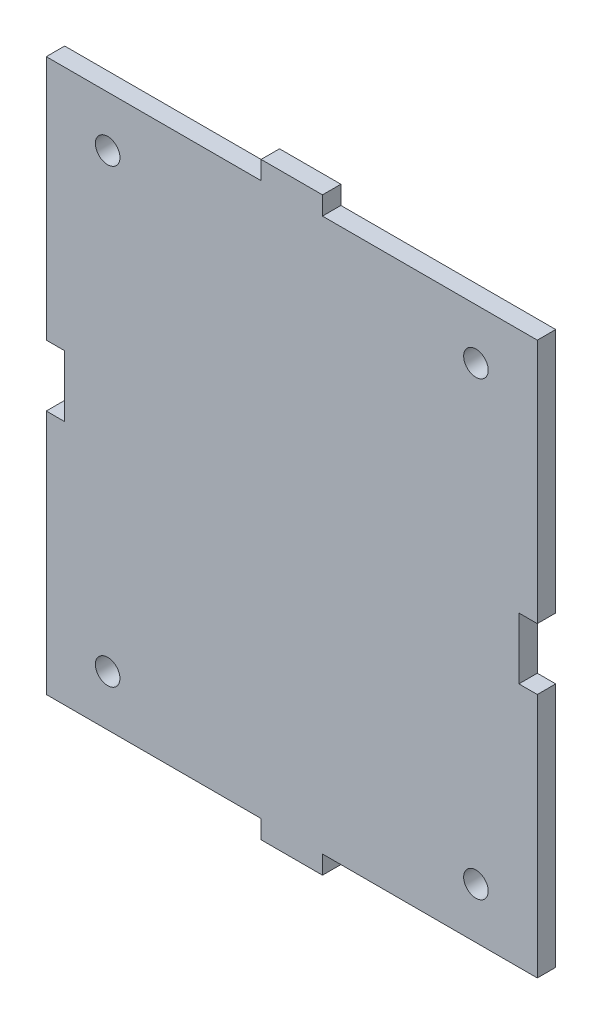
ISO-10303-21;
HEADER;
FILE_DESCRIPTION(('STEP AP214'),'2;1');
FILE_NAME('part.step','',(''),(''),'','','');
FILE_SCHEMA(('AUTOMOTIVE_DESIGN { 1 0 10303 214 1 1 1 1 }'));
ENDSEC;
DATA;
#1=APPLICATION_CONTEXT('core data for automotive mechanical design processes');
#2=APPLICATION_PROTOCOL_DEFINITION('international standard','automotive_design',2000,#1);
#3=PRODUCT_CONTEXT('',#1,'mechanical');
#4=PRODUCT('Part','Part','',(#3));
#5=PRODUCT_RELATED_PRODUCT_CATEGORY('part','',(#4));
#6=PRODUCT_DEFINITION_FORMATION('','',#4);
#7=PRODUCT_DEFINITION_CONTEXT('part definition',#1,'design');
#8=PRODUCT_DEFINITION('design','',#6,#7);
#9=PRODUCT_DEFINITION_SHAPE('','',#8);
#10=(LENGTH_UNIT() NAMED_UNIT(*) SI_UNIT(.MILLI.,.METRE.));
#11=(NAMED_UNIT(*) PLANE_ANGLE_UNIT() SI_UNIT($,.RADIAN.));
#12=(NAMED_UNIT(*) SI_UNIT($,.STERADIAN.) SOLID_ANGLE_UNIT());
#13=UNCERTAINTY_MEASURE_WITH_UNIT(LENGTH_MEASURE(1.E-05),#10,'distance_accuracy_value','');
#14=(GEOMETRIC_REPRESENTATION_CONTEXT(3) GLOBAL_UNCERTAINTY_ASSIGNED_CONTEXT((#13)) GLOBAL_UNIT_ASSIGNED_CONTEXT((#10,
#11,#12)) REPRESENTATION_CONTEXT('',''));
#15=CARTESIAN_POINT('',(0.,0.,0.));
#16=DIRECTION('',(0.,0.,1.));
#17=DIRECTION('',(1.,0.,0.));
#18=AXIS2_PLACEMENT_3D('',#15,#16,#17);
#19=CARTESIAN_POINT('',(0.,0.,3.));
#20=DIRECTION('',(0.,0.,-1.));
#21=DIRECTION('',(-1.,0.,0.));
#22=AXIS2_PLACEMENT_3D('',#19,#20,#21);
#23=PLANE('',#22);
#24=DIRECTION('',(-1.,0.,0.));
#25=VECTOR('',#24,1.);
#26=CARTESIAN_POINT('',(-40.,8.24999999999999,3.));
#27=LINE('',#26,#25);
#28=CARTESIAN_POINT('',(-5.,8.24999999999999,3.));
#29=VERTEX_POINT('',#28);
#30=CARTESIAN_POINT('',(-40.,8.24999999999999,3.));
#31=VERTEX_POINT('',#30);
#32=EDGE_CURVE('E245',#29,#31,#27,.T.);
#33=ORIENTED_EDGE('',*,*,#32,.T.);
#34=DIRECTION('',(0.,-1.,0.));
#35=VECTOR('',#34,1.);
#36=CARTESIAN_POINT('',(-40.,-31.75,3.));
#37=LINE('',#36,#35);
#38=CARTESIAN_POINT('',(-40.,-31.75,3.));
#39=VERTEX_POINT('',#38);
#40=EDGE_CURVE('E133',#31,#39,#37,.T.);
#41=ORIENTED_EDGE('',*,*,#40,.T.);
#42=DIRECTION('',(1.,0.,0.));
#43=VECTOR('',#42,1.);
#44=CARTESIAN_POINT('',(-37.,-31.75,3.));
#45=LINE('',#44,#43);
#46=CARTESIAN_POINT('',(-37.,-31.75,3.));
#47=VERTEX_POINT('',#46);
#48=EDGE_CURVE('E296',#39,#47,#45,.T.);
#49=ORIENTED_EDGE('',*,*,#48,.T.);
#50=DIRECTION('',(0.,-1.,0.));
#51=VECTOR('',#50,1.);
#52=CARTESIAN_POINT('',(-37.,-41.75,3.));
#53=LINE('',#52,#51);
#54=CARTESIAN_POINT('',(-37.,-41.75,3.));
#55=VERTEX_POINT('',#54);
#56=EDGE_CURVE('E315',#47,#55,#53,.T.);
#57=ORIENTED_EDGE('',*,*,#56,.T.);
#58=DIRECTION('',(-1.,0.,0.));
#59=VECTOR('',#58,1.);
#60=CARTESIAN_POINT('',(-37.,-41.75,3.));
#61=LINE('',#60,#59);
#62=CARTESIAN_POINT('',(-40.,-41.75,3.));
#63=VERTEX_POINT('',#62);
#64=EDGE_CURVE('E312',#55,#63,#61,.T.);
#65=ORIENTED_EDGE('',*,*,#64,.T.);
#66=DIRECTION('',(0.,-1.,0.));
#67=VECTOR('',#66,1.);
#68=CARTESIAN_POINT('',(-40.,-81.75,3.));
#69=LINE('',#68,#67);
#70=CARTESIAN_POINT('',(-40.,-81.75,3.));
#71=VERTEX_POINT('',#70);
#72=EDGE_CURVE('E314',#63,#71,#69,.T.);
#73=ORIENTED_EDGE('',*,*,#72,.T.);
#74=DIRECTION('',(1.,0.,0.));
#75=VECTOR('',#74,1.);
#76=CARTESIAN_POINT('',(-40.,-81.75,3.));
#77=LINE('',#76,#75);
#78=CARTESIAN_POINT('',(-5.,-81.75,3.));
#79=VERTEX_POINT('',#78);
#80=EDGE_CURVE('E317',#71,#79,#77,.T.);
#81=ORIENTED_EDGE('',*,*,#80,.T.);
#82=DIRECTION('',(0.,-1.,0.));
#83=VECTOR('',#82,1.);
#84=CARTESIAN_POINT('',(-5.,-84.75,3.));
#85=LINE('',#84,#83);
#86=CARTESIAN_POINT('',(-5.,-84.75,3.));
#87=VERTEX_POINT('',#86);
#88=EDGE_CURVE('E323',#79,#87,#85,.T.);
#89=ORIENTED_EDGE('',*,*,#88,.T.);
#90=DIRECTION('',(1.,0.,0.));
#91=VECTOR('',#90,1.);
#92=CARTESIAN_POINT('',(-5.,-84.75,3.));
#93=LINE('',#92,#91);
#94=CARTESIAN_POINT('',(5.,-84.75,3.));
#95=VERTEX_POINT('',#94);
#96=EDGE_CURVE('E325',#87,#95,#93,.T.);
#97=ORIENTED_EDGE('',*,*,#96,.T.);
#98=DIRECTION('',(0.,1.,0.));
#99=VECTOR('',#98,1.);
#100=CARTESIAN_POINT('',(5.,-84.75,3.));
#101=LINE('',#100,#99);
#102=CARTESIAN_POINT('',(5.,-81.75,3.));
#103=VERTEX_POINT('',#102);
#104=EDGE_CURVE('E327',#95,#103,#101,.T.);
#105=ORIENTED_EDGE('',*,*,#104,.T.);
#106=DIRECTION('',(1.,0.,0.));
#107=VECTOR('',#106,1.);
#108=CARTESIAN_POINT('',(5.,-81.75,3.));
#109=LINE('',#108,#107);
#110=CARTESIAN_POINT('',(40.,-81.75,3.));
#111=VERTEX_POINT('',#110);
#112=EDGE_CURVE('E329',#103,#111,#109,.T.);
#113=ORIENTED_EDGE('',*,*,#112,.T.);
#114=DIRECTION('',(0.,1.,0.));
#115=VECTOR('',#114,1.);
#116=CARTESIAN_POINT('',(40.,-81.75,3.));
#117=LINE('',#116,#115);
#118=CARTESIAN_POINT('',(40.,-41.75,3.));
#119=VERTEX_POINT('',#118);
#120=EDGE_CURVE('E331',#111,#119,#117,.T.);
#121=ORIENTED_EDGE('',*,*,#120,.T.);
#122=DIRECTION('',(-1.,0.,0.));
#123=VECTOR('',#122,1.);
#124=CARTESIAN_POINT('',(37.,-41.75,3.));
#125=LINE('',#124,#123);
#126=CARTESIAN_POINT('',(37.,-41.75,3.));
#127=VERTEX_POINT('',#126);
#128=EDGE_CURVE('E333',#119,#127,#125,.T.);
#129=ORIENTED_EDGE('',*,*,#128,.T.);
#130=DIRECTION('',(0.,1.,0.));
#131=VECTOR('',#130,1.);
#132=CARTESIAN_POINT('',(37.,-41.75,3.));
#133=LINE('',#132,#131);
#134=CARTESIAN_POINT('',(37.,-31.75,3.));
#135=VERTEX_POINT('',#134);
#136=EDGE_CURVE('E335',#127,#135,#133,.T.);
#137=ORIENTED_EDGE('',*,*,#136,.T.);
#138=DIRECTION('',(1.,0.,0.));
#139=VECTOR('',#138,1.);
#140=CARTESIAN_POINT('',(37.,-31.75,3.));
#141=LINE('',#140,#139);
#142=CARTESIAN_POINT('',(40.,-31.75,3.));
#143=VERTEX_POINT('',#142);
#144=EDGE_CURVE('E337',#135,#143,#141,.T.);
#145=ORIENTED_EDGE('',*,*,#144,.T.);
#146=DIRECTION('',(0.,1.,0.));
#147=VECTOR('',#146,1.);
#148=CARTESIAN_POINT('',(40.,-31.75,3.));
#149=LINE('',#148,#147);
#150=CARTESIAN_POINT('',(40.,8.24999999999999,3.));
#151=VERTEX_POINT('',#150);
#152=EDGE_CURVE('E339',#143,#151,#149,.T.);
#153=ORIENTED_EDGE('',*,*,#152,.T.);
#154=DIRECTION('',(-1.,0.,0.));
#155=VECTOR('',#154,1.);
#156=CARTESIAN_POINT('',(5.,8.24999999999999,3.));
#157=LINE('',#156,#155);
#158=CARTESIAN_POINT('',(5.,8.24999999999999,3.));
#159=VERTEX_POINT('',#158);
#160=EDGE_CURVE('E188',#151,#159,#157,.T.);
#161=ORIENTED_EDGE('',*,*,#160,.T.);
#162=DIRECTION('',(0.,1.,0.));
#163=VECTOR('',#162,1.);
#164=CARTESIAN_POINT('',(5.,11.25,3.));
#165=LINE('',#164,#163);
#166=CARTESIAN_POINT('',(5.,11.25,3.));
#167=VERTEX_POINT('',#166);
#168=EDGE_CURVE('E182',#159,#167,#165,.T.);
#169=ORIENTED_EDGE('',*,*,#168,.T.);
#170=DIRECTION('',(-1.,0.,0.));
#171=VECTOR('',#170,1.);
#172=CARTESIAN_POINT('',(-5.,11.25,3.));
#173=LINE('',#172,#171);
#174=CARTESIAN_POINT('',(-5.,11.25,3.));
#175=VERTEX_POINT('',#174);
#176=EDGE_CURVE('E186',#167,#175,#173,.T.);
#177=ORIENTED_EDGE('',*,*,#176,.T.);
#178=DIRECTION('',(0.,-1.,0.));
#179=VECTOR('',#178,1.);
#180=CARTESIAN_POINT('',(-5.,11.25,3.));
#181=LINE('',#180,#179);
#182=EDGE_CURVE('E54',#175,#29,#181,.T.);
#183=ORIENTED_EDGE('',*,*,#182,.T.);
#184=EDGE_LOOP('',(#33,#41,#49,#57,#65,#73,#81,#89,#97,#105,#113,#121,#129,#137,#145,#153,#161,
#169,#177,#183));
#185=FACE_BOUND('',#184,.T.);
#186=CARTESIAN_POINT('',(30.,0.,3.));
#187=DIRECTION('',(0.,0.,1.));
#188=DIRECTION('',(1.,0.,0.));
#189=AXIS2_PLACEMENT_3D('',#186,#187,#188);
#190=CIRCLE('',#189,2.);
#191=CARTESIAN_POINT('',(32.,0.,3.));
#192=VERTEX_POINT('',#191);
#193=EDGE_CURVE('E210',#192,#192,#190,.T.);
#194=ORIENTED_EDGE('',*,*,#193,.F.);
#195=EDGE_LOOP('',(#194));
#196=FACE_BOUND('',#195,.T.);
#197=CARTESIAN_POINT('',(30.,-73.5,3.));
#198=DIRECTION('',(0.,0.,1.));
#199=DIRECTION('',(-1.,0.,0.));
#200=AXIS2_PLACEMENT_3D('',#197,#198,#199);
#201=CIRCLE('',#200,2.);
#202=CARTESIAN_POINT('',(28.,-73.5,3.));
#203=VERTEX_POINT('',#202);
#204=EDGE_CURVE('E403',#203,#203,#201,.T.);
#205=ORIENTED_EDGE('',*,*,#204,.F.);
#206=EDGE_LOOP('',(#205));
#207=FACE_BOUND('',#206,.T.);
#208=CARTESIAN_POINT('',(-30.,-73.5,3.));
#209=DIRECTION('',(0.,0.,1.));
#210=DIRECTION('',(1.,0.,0.));
#211=AXIS2_PLACEMENT_3D('',#208,#209,#210);
#212=CIRCLE('',#211,2.);
#213=CARTESIAN_POINT('',(-28.,-73.5,3.));
#214=VERTEX_POINT('',#213);
#215=EDGE_CURVE('E397',#214,#214,#212,.T.);
#216=ORIENTED_EDGE('',*,*,#215,.F.);
#217=EDGE_LOOP('',(#216));
#218=FACE_BOUND('',#217,.T.);
#219=CARTESIAN_POINT('',(-30.,0.,3.));
#220=DIRECTION('',(0.,0.,1.));
#221=DIRECTION('',(-1.,0.,0.));
#222=AXIS2_PLACEMENT_3D('',#219,#220,#221);
#223=CIRCLE('',#222,2.);
#224=CARTESIAN_POINT('',(-32.,0.,3.));
#225=VERTEX_POINT('',#224);
#226=EDGE_CURVE('E388',#225,#225,#223,.T.);
#227=ORIENTED_EDGE('',*,*,#226,.F.);
#228=EDGE_LOOP('',(#227));
#229=FACE_BOUND('',#228,.T.);
#230=ADVANCED_FACE('F37',(#185,#196,#207,#218,#229),#23,.F.);
#231=CARTESIAN_POINT('',(0.,0.,0.));
#232=DIRECTION('',(0.,0.,-1.));
#233=DIRECTION('',(-1.,0.,0.));
#234=AXIS2_PLACEMENT_3D('',#231,#232,#233);
#235=PLANE('',#234);
#236=CARTESIAN_POINT('',(-30.,-73.5,0.));
#237=DIRECTION('',(0.,0.,1.));
#238=DIRECTION('',(1.,0.,0.));
#239=AXIS2_PLACEMENT_3D('',#236,#237,#238);
#240=CIRCLE('',#239,2.);
#241=CARTESIAN_POINT('',(-28.,-73.5,0.));
#242=VERTEX_POINT('',#241);
#243=EDGE_CURVE('E394',#242,#242,#240,.T.);
#244=ORIENTED_EDGE('',*,*,#243,.T.);
#245=EDGE_LOOP('',(#244));
#246=FACE_BOUND('',#245,.T.);
#247=CARTESIAN_POINT('',(30.,0.,0.));
#248=DIRECTION('',(0.,0.,1.));
#249=DIRECTION('',(1.,0.,0.));
#250=AXIS2_PLACEMENT_3D('',#247,#248,#249);
#251=CIRCLE('',#250,2.);
#252=CARTESIAN_POINT('',(32.,0.,0.));
#253=VERTEX_POINT('',#252);
#254=EDGE_CURVE('E406',#253,#253,#251,.T.);
#255=ORIENTED_EDGE('',*,*,#254,.T.);
#256=EDGE_LOOP('',(#255));
#257=FACE_BOUND('',#256,.T.);
#258=DIRECTION('',(-1.,0.,0.));
#259=VECTOR('',#258,1.);
#260=CARTESIAN_POINT('',(-40.,8.24999999999999,0.));
#261=LINE('',#260,#259);
#262=CARTESIAN_POINT('',(-5.,8.24999999999999,0.));
#263=VERTEX_POINT('',#262);
#264=CARTESIAN_POINT('',(-40.,8.24999999999999,0.));
#265=VERTEX_POINT('',#264);
#266=EDGE_CURVE('E206',#263,#265,#261,.T.);
#267=ORIENTED_EDGE('',*,*,#266,.F.);
#268=DIRECTION('',(0.,-1.,0.));
#269=VECTOR('',#268,1.);
#270=CARTESIAN_POINT('',(-5.,11.25,0.));
#271=LINE('',#270,#269);
#272=CARTESIAN_POINT('',(-5.,11.25,0.));
#273=VERTEX_POINT('',#272);
#274=EDGE_CURVE('E125',#273,#263,#271,.T.);
#275=ORIENTED_EDGE('',*,*,#274,.F.);
#276=DIRECTION('',(-1.,0.,0.));
#277=VECTOR('',#276,1.);
#278=CARTESIAN_POINT('',(-5.,11.25,0.));
#279=LINE('',#278,#277);
#280=CARTESIAN_POINT('',(5.,11.25,0.));
#281=VERTEX_POINT('',#280);
#282=EDGE_CURVE('E119',#281,#273,#279,.T.);
#283=ORIENTED_EDGE('',*,*,#282,.F.);
#284=DIRECTION('',(0.,1.,0.));
#285=VECTOR('',#284,1.);
#286=CARTESIAN_POINT('',(5.,11.25,0.));
#287=LINE('',#286,#285);
#288=CARTESIAN_POINT('',(5.,8.24999999999999,0.));
#289=VERTEX_POINT('',#288);
#290=EDGE_CURVE('E196',#289,#281,#287,.T.);
#291=ORIENTED_EDGE('',*,*,#290,.F.);
#292=DIRECTION('',(-1.,0.,0.));
#293=VECTOR('',#292,1.);
#294=CARTESIAN_POINT('',(5.,8.24999999999999,0.));
#295=LINE('',#294,#293);
#296=CARTESIAN_POINT('',(40.,8.24999999999999,0.));
#297=VERTEX_POINT('',#296);
#298=EDGE_CURVE('E240',#297,#289,#295,.T.);
#299=ORIENTED_EDGE('',*,*,#298,.F.);
#300=DIRECTION('',(0.,1.,0.));
#301=VECTOR('',#300,1.);
#302=CARTESIAN_POINT('',(40.,-31.75,0.));
#303=LINE('',#302,#301);
#304=CARTESIAN_POINT('',(40.,-31.75,0.));
#305=VERTEX_POINT('',#304);
#306=EDGE_CURVE('E238',#305,#297,#303,.T.);
#307=ORIENTED_EDGE('',*,*,#306,.F.);
#308=DIRECTION('',(1.,0.,0.));
#309=VECTOR('',#308,1.);
#310=CARTESIAN_POINT('',(37.,-31.75,0.));
#311=LINE('',#310,#309);
#312=CARTESIAN_POINT('',(37.,-31.75,0.));
#313=VERTEX_POINT('',#312);
#314=EDGE_CURVE('E236',#313,#305,#311,.T.);
#315=ORIENTED_EDGE('',*,*,#314,.F.);
#316=DIRECTION('',(0.,1.,0.));
#317=VECTOR('',#316,1.);
#318=CARTESIAN_POINT('',(37.,-41.75,0.));
#319=LINE('',#318,#317);
#320=CARTESIAN_POINT('',(37.,-41.75,0.));
#321=VERTEX_POINT('',#320);
#322=EDGE_CURVE('E234',#321,#313,#319,.T.);
#323=ORIENTED_EDGE('',*,*,#322,.F.);
#324=DIRECTION('',(-1.,0.,0.));
#325=VECTOR('',#324,1.);
#326=CARTESIAN_POINT('',(37.,-41.75,0.));
#327=LINE('',#326,#325);
#328=CARTESIAN_POINT('',(40.,-41.75,0.));
#329=VERTEX_POINT('',#328);
#330=EDGE_CURVE('E232',#329,#321,#327,.T.);
#331=ORIENTED_EDGE('',*,*,#330,.F.);
#332=DIRECTION('',(0.,1.,0.));
#333=VECTOR('',#332,1.);
#334=CARTESIAN_POINT('',(40.,-81.75,0.));
#335=LINE('',#334,#333);
#336=CARTESIAN_POINT('',(40.,-81.75,0.));
#337=VERTEX_POINT('',#336);
#338=EDGE_CURVE('E230',#337,#329,#335,.T.);
#339=ORIENTED_EDGE('',*,*,#338,.F.);
#340=DIRECTION('',(1.,0.,0.));
#341=VECTOR('',#340,1.);
#342=CARTESIAN_POINT('',(5.,-81.75,0.));
#343=LINE('',#342,#341);
#344=CARTESIAN_POINT('',(5.,-81.75,0.));
#345=VERTEX_POINT('',#344);
#346=EDGE_CURVE('E228',#345,#337,#343,.T.);
#347=ORIENTED_EDGE('',*,*,#346,.F.);
#348=DIRECTION('',(0.,1.,0.));
#349=VECTOR('',#348,1.);
#350=CARTESIAN_POINT('',(5.,-84.75,0.));
#351=LINE('',#350,#349);
#352=CARTESIAN_POINT('',(5.,-84.75,0.));
#353=VERTEX_POINT('',#352);
#354=EDGE_CURVE('E226',#353,#345,#351,.T.);
#355=ORIENTED_EDGE('',*,*,#354,.F.);
#356=DIRECTION('',(1.,0.,0.));
#357=VECTOR('',#356,1.);
#358=CARTESIAN_POINT('',(-5.,-84.75,0.));
#359=LINE('',#358,#357);
#360=CARTESIAN_POINT('',(-5.,-84.75,0.));
#361=VERTEX_POINT('',#360);
#362=EDGE_CURVE('E224',#361,#353,#359,.T.);
#363=ORIENTED_EDGE('',*,*,#362,.F.);
#364=DIRECTION('',(0.,-1.,0.));
#365=VECTOR('',#364,1.);
#366=CARTESIAN_POINT('',(-5.,-84.75,0.));
#367=LINE('',#366,#365);
#368=CARTESIAN_POINT('',(-5.,-81.75,0.));
#369=VERTEX_POINT('',#368);
#370=EDGE_CURVE('E222',#369,#361,#367,.T.);
#371=ORIENTED_EDGE('',*,*,#370,.F.);
#372=DIRECTION('',(1.,0.,0.));
#373=VECTOR('',#372,1.);
#374=CARTESIAN_POINT('',(-40.,-81.75,0.));
#375=LINE('',#374,#373);
#376=CARTESIAN_POINT('',(-40.,-81.75,0.));
#377=VERTEX_POINT('',#376);
#378=EDGE_CURVE('E220',#377,#369,#375,.T.);
#379=ORIENTED_EDGE('',*,*,#378,.F.);
#380=DIRECTION('',(0.,-1.,0.));
#381=VECTOR('',#380,1.);
#382=CARTESIAN_POINT('',(-40.,-81.75,0.));
#383=LINE('',#382,#381);
#384=CARTESIAN_POINT('',(-40.,-41.75,0.));
#385=VERTEX_POINT('',#384);
#386=EDGE_CURVE('E218',#385,#377,#383,.T.);
#387=ORIENTED_EDGE('',*,*,#386,.F.);
#388=DIRECTION('',(-1.,0.,0.));
#389=VECTOR('',#388,1.);
#390=CARTESIAN_POINT('',(-37.,-41.75,0.));
#391=LINE('',#390,#389);
#392=CARTESIAN_POINT('',(-37.,-41.75,0.));
#393=VERTEX_POINT('',#392);
#394=EDGE_CURVE('E216',#393,#385,#391,.T.);
#395=ORIENTED_EDGE('',*,*,#394,.F.);
#396=DIRECTION('',(0.,-1.,0.));
#397=VECTOR('',#396,1.);
#398=CARTESIAN_POINT('',(-37.,-41.75,0.));
#399=LINE('',#398,#397);
#400=CARTESIAN_POINT('',(-37.,-31.75,0.));
#401=VERTEX_POINT('',#400);
#402=EDGE_CURVE('E214',#401,#393,#399,.T.);
#403=ORIENTED_EDGE('',*,*,#402,.F.);
#404=DIRECTION('',(1.,0.,0.));
#405=VECTOR('',#404,1.);
#406=CARTESIAN_POINT('',(-37.,-31.75,0.));
#407=LINE('',#406,#405);
#408=CARTESIAN_POINT('',(-40.,-31.75,0.));
#409=VERTEX_POINT('',#408);
#410=EDGE_CURVE('E212',#409,#401,#407,.T.);
#411=ORIENTED_EDGE('',*,*,#410,.F.);
#412=DIRECTION('',(0.,-1.,0.));
#413=VECTOR('',#412,1.);
#414=CARTESIAN_POINT('',(-40.,-31.75,0.));
#415=LINE('',#414,#413);
#416=EDGE_CURVE('E209',#265,#409,#415,.T.);
#417=ORIENTED_EDGE('',*,*,#416,.F.);
#418=EDGE_LOOP('',(#267,#275,#283,#291,#299,#307,#315,#323,#331,#339,#347,#355,#363,#371,#379,
#387,#395,#403,#411,#417));
#419=FACE_BOUND('',#418,.T.);
#420=CARTESIAN_POINT('',(30.,-73.5,0.));
#421=DIRECTION('',(0.,0.,1.));
#422=DIRECTION('',(-1.,0.,0.));
#423=AXIS2_PLACEMENT_3D('',#420,#421,#422);
#424=CIRCLE('',#423,2.);
#425=CARTESIAN_POINT('',(28.,-73.5,0.));
#426=VERTEX_POINT('',#425);
#427=EDGE_CURVE('E400',#426,#426,#424,.T.);
#428=ORIENTED_EDGE('',*,*,#427,.T.);
#429=EDGE_LOOP('',(#428));
#430=FACE_BOUND('',#429,.T.);
#431=CARTESIAN_POINT('',(-30.,0.,0.));
#432=DIRECTION('',(0.,0.,1.));
#433=DIRECTION('',(-1.,0.,0.));
#434=AXIS2_PLACEMENT_3D('',#431,#432,#433);
#435=CIRCLE('',#434,2.);
#436=CARTESIAN_POINT('',(-32.,0.,0.));
#437=VERTEX_POINT('',#436);
#438=EDGE_CURVE('E391',#437,#437,#435,.T.);
#439=ORIENTED_EDGE('',*,*,#438,.T.);
#440=EDGE_LOOP('',(#439));
#441=FACE_BOUND('',#440,.T.);
#442=ADVANCED_FACE('F300',(#246,#257,#419,#430,#441),#235,.T.);
#443=CARTESIAN_POINT('',(-40.,8.24999999999999,3.));
#444=DIRECTION('',(0.,-1.,0.));
#445=DIRECTION('',(0.,0.,-1.));
#446=AXIS2_PLACEMENT_3D('',#443,#444,#445);
#447=PLANE('',#446);
#448=ORIENTED_EDGE('',*,*,#266,.T.);
#449=DIRECTION('',(0.,0.,-1.));
#450=VECTOR('',#449,1.);
#451=CARTESIAN_POINT('',(-40.,8.24999999999999,3.));
#452=LINE('',#451,#450);
#453=EDGE_CURVE('E11',#31,#265,#452,.T.);
#454=ORIENTED_EDGE('',*,*,#453,.F.);
#455=ORIENTED_EDGE('',*,*,#32,.F.);
#456=DIRECTION('',(0.,0.,-1.));
#457=VECTOR('',#456,1.);
#458=CARTESIAN_POINT('',(-5.,8.24999999999999,3.));
#459=LINE('',#458,#457);
#460=EDGE_CURVE('E202',#29,#263,#459,.T.);
#461=ORIENTED_EDGE('',*,*,#460,.T.);
#462=EDGE_LOOP('',(#448,#454,#455,#461));
#463=FACE_BOUND('',#462,.T.);
#464=ADVANCED_FACE('F39',(#463),#447,.F.);
#465=CARTESIAN_POINT('',(-40.,-31.75,3.));
#466=DIRECTION('',(1.,0.,0.));
#467=DIRECTION('',(0.,0.,-1.));
#468=AXIS2_PLACEMENT_3D('',#465,#466,#467);
#469=PLANE('',#468);
#470=ORIENTED_EDGE('',*,*,#416,.T.);
#471=DIRECTION('',(0.,0.,-1.));
#472=VECTOR('',#471,1.);
#473=CARTESIAN_POINT('',(-40.,-31.75,3.));
#474=LINE('',#473,#472);
#475=EDGE_CURVE('E46',#39,#409,#474,.T.);
#476=ORIENTED_EDGE('',*,*,#475,.F.);
#477=ORIENTED_EDGE('',*,*,#40,.F.);
#478=ORIENTED_EDGE('',*,*,#453,.T.);
#479=EDGE_LOOP('',(#470,#476,#477,#478));
#480=FACE_BOUND('',#479,.T.);
#481=ADVANCED_FACE('F616',(#480),#469,.F.);
#482=CARTESIAN_POINT('',(-37.,-31.75,3.));
#483=DIRECTION('',(0.,1.,0.));
#484=DIRECTION('',(0.,0.,1.));
#485=AXIS2_PLACEMENT_3D('',#482,#483,#484);
#486=PLANE('',#485);
#487=ORIENTED_EDGE('',*,*,#410,.T.);
#488=DIRECTION('',(0.,0.,-1.));
#489=VECTOR('',#488,1.);
#490=CARTESIAN_POINT('',(-37.,-31.75,3.));
#491=LINE('',#490,#489);
#492=EDGE_CURVE('E288',#47,#401,#491,.T.);
#493=ORIENTED_EDGE('',*,*,#492,.F.);
#494=ORIENTED_EDGE('',*,*,#48,.F.);
#495=ORIENTED_EDGE('',*,*,#475,.T.);
#496=EDGE_LOOP('',(#487,#493,#494,#495));
#497=FACE_BOUND('',#496,.T.);
#498=ADVANCED_FACE('F294',(#497),#486,.F.);
#499=CARTESIAN_POINT('',(-37.,-41.75,3.));
#500=DIRECTION('',(1.,0.,0.));
#501=DIRECTION('',(0.,0.,-1.));
#502=AXIS2_PLACEMENT_3D('',#499,#500,#501);
#503=PLANE('',#502);
#504=ORIENTED_EDGE('',*,*,#402,.T.);
#505=DIRECTION('',(0.,0.,-1.));
#506=VECTOR('',#505,1.);
#507=CARTESIAN_POINT('',(-37.,-41.75,3.));
#508=LINE('',#507,#506);
#509=EDGE_CURVE('E285',#55,#393,#508,.T.);
#510=ORIENTED_EDGE('',*,*,#509,.F.);
#511=ORIENTED_EDGE('',*,*,#56,.F.);
#512=ORIENTED_EDGE('',*,*,#492,.T.);
#513=EDGE_LOOP('',(#504,#510,#511,#512));
#514=FACE_BOUND('',#513,.T.);
#515=ADVANCED_FACE('F306',(#514),#503,.F.);
#516=CARTESIAN_POINT('',(-37.,-41.75,3.));
#517=DIRECTION('',(0.,-1.,0.));
#518=DIRECTION('',(1.,0.,0.));
#519=AXIS2_PLACEMENT_3D('',#516,#517,#518);
#520=PLANE('',#519);
#521=ORIENTED_EDGE('',*,*,#394,.T.);
#522=DIRECTION('',(0.,0.,-1.));
#523=VECTOR('',#522,1.);
#524=CARTESIAN_POINT('',(-40.,-41.75,3.));
#525=LINE('',#524,#523);
#526=EDGE_CURVE('E282',#63,#385,#525,.T.);
#527=ORIENTED_EDGE('',*,*,#526,.F.);
#528=ORIENTED_EDGE('',*,*,#64,.F.);
#529=ORIENTED_EDGE('',*,*,#509,.T.);
#530=EDGE_LOOP('',(#521,#527,#528,#529));
#531=FACE_BOUND('',#530,.T.);
#532=ADVANCED_FACE('F310',(#531),#520,.F.);
#533=CARTESIAN_POINT('',(-40.,-81.75,3.));
#534=DIRECTION('',(1.,0.,0.));
#535=DIRECTION('',(0.,0.,-1.));
#536=AXIS2_PLACEMENT_3D('',#533,#534,#535);
#537=PLANE('',#536);
#538=ORIENTED_EDGE('',*,*,#386,.T.);
#539=DIRECTION('',(0.,0.,-1.));
#540=VECTOR('',#539,1.);
#541=CARTESIAN_POINT('',(-40.,-81.75,3.));
#542=LINE('',#541,#540);
#543=EDGE_CURVE('E279',#71,#377,#542,.T.);
#544=ORIENTED_EDGE('',*,*,#543,.F.);
#545=ORIENTED_EDGE('',*,*,#72,.F.);
#546=ORIENTED_EDGE('',*,*,#526,.T.);
#547=EDGE_LOOP('',(#538,#544,#545,#546));
#548=FACE_BOUND('',#547,.T.);
#549=ADVANCED_FACE('F577',(#548),#537,.F.);
#550=CARTESIAN_POINT('',(-40.,-81.75,3.));
#551=DIRECTION('',(0.,1.,0.));
#552=DIRECTION('',(-1.,0.,0.));
#553=AXIS2_PLACEMENT_3D('',#550,#551,#552);
#554=PLANE('',#553);
#555=ORIENTED_EDGE('',*,*,#378,.T.);
#556=DIRECTION('',(0.,0.,-1.));
#557=VECTOR('',#556,1.);
#558=CARTESIAN_POINT('',(-5.,-81.75,3.));
#559=LINE('',#558,#557);
#560=EDGE_CURVE('E276',#79,#369,#559,.T.);
#561=ORIENTED_EDGE('',*,*,#560,.F.);
#562=ORIENTED_EDGE('',*,*,#80,.F.);
#563=ORIENTED_EDGE('',*,*,#543,.T.);
#564=EDGE_LOOP('',(#555,#561,#562,#563));
#565=FACE_BOUND('',#564,.T.);
#566=ADVANCED_FACE('F566',(#565),#554,.F.);
#567=CARTESIAN_POINT('',(-5.,-84.75,3.));
#568=DIRECTION('',(1.,0.,0.));
#569=DIRECTION('',(0.,1.,0.));
#570=AXIS2_PLACEMENT_3D('',#567,#568,#569);
#571=PLANE('',#570);
#572=ORIENTED_EDGE('',*,*,#370,.T.);
#573=DIRECTION('',(0.,0.,-1.));
#574=VECTOR('',#573,1.);
#575=CARTESIAN_POINT('',(-5.,-84.75,3.));
#576=LINE('',#575,#574);
#577=EDGE_CURVE('E273',#87,#361,#576,.T.);
#578=ORIENTED_EDGE('',*,*,#577,.F.);
#579=ORIENTED_EDGE('',*,*,#88,.F.);
#580=ORIENTED_EDGE('',*,*,#560,.T.);
#581=EDGE_LOOP('',(#572,#578,#579,#580));
#582=FACE_BOUND('',#581,.T.);
#583=ADVANCED_FACE('F555',(#582),#571,.F.);
#584=CARTESIAN_POINT('',(-5.,-84.75,3.));
#585=DIRECTION('',(0.,1.,0.));
#586=DIRECTION('',(-1.,0.,0.));
#587=AXIS2_PLACEMENT_3D('',#584,#585,#586);
#588=PLANE('',#587);
#589=ORIENTED_EDGE('',*,*,#362,.T.);
#590=DIRECTION('',(0.,0.,-1.));
#591=VECTOR('',#590,1.);
#592=CARTESIAN_POINT('',(5.,-84.75,3.));
#593=LINE('',#592,#591);
#594=EDGE_CURVE('E270',#95,#353,#593,.T.);
#595=ORIENTED_EDGE('',*,*,#594,.F.);
#596=ORIENTED_EDGE('',*,*,#96,.F.);
#597=ORIENTED_EDGE('',*,*,#577,.T.);
#598=EDGE_LOOP('',(#589,#595,#596,#597));
#599=FACE_BOUND('',#598,.T.);
#600=ADVANCED_FACE('F544',(#599),#588,.F.);
#601=CARTESIAN_POINT('',(5.,-84.75,3.));
#602=DIRECTION('',(-1.,0.,0.));
#603=DIRECTION('',(0.,-1.,0.));
#604=AXIS2_PLACEMENT_3D('',#601,#602,#603);
#605=PLANE('',#604);
#606=ORIENTED_EDGE('',*,*,#354,.T.);
#607=DIRECTION('',(0.,0.,-1.));
#608=VECTOR('',#607,1.);
#609=CARTESIAN_POINT('',(5.,-81.75,3.));
#610=LINE('',#609,#608);
#611=EDGE_CURVE('E267',#103,#345,#610,.T.);
#612=ORIENTED_EDGE('',*,*,#611,.F.);
#613=ORIENTED_EDGE('',*,*,#104,.F.);
#614=ORIENTED_EDGE('',*,*,#594,.T.);
#615=EDGE_LOOP('',(#606,#612,#613,#614));
#616=FACE_BOUND('',#615,.T.);
#617=ADVANCED_FACE('F533',(#616),#605,.F.);
#618=CARTESIAN_POINT('',(5.,-81.75,3.));
#619=DIRECTION('',(0.,1.,0.));
#620=DIRECTION('',(-1.,0.,0.));
#621=AXIS2_PLACEMENT_3D('',#618,#619,#620);
#622=PLANE('',#621);
#623=ORIENTED_EDGE('',*,*,#346,.T.);
#624=DIRECTION('',(0.,0.,-1.));
#625=VECTOR('',#624,1.);
#626=CARTESIAN_POINT('',(40.,-81.75,3.));
#627=LINE('',#626,#625);
#628=EDGE_CURVE('E264',#111,#337,#627,.T.);
#629=ORIENTED_EDGE('',*,*,#628,.F.);
#630=ORIENTED_EDGE('',*,*,#112,.F.);
#631=ORIENTED_EDGE('',*,*,#611,.T.);
#632=EDGE_LOOP('',(#623,#629,#630,#631));
#633=FACE_BOUND('',#632,.T.);
#634=ADVANCED_FACE('F522',(#633),#622,.F.);
#635=CARTESIAN_POINT('',(40.,-81.75,3.));
#636=DIRECTION('',(-1.,0.,0.));
#637=DIRECTION('',(0.,0.,1.));
#638=AXIS2_PLACEMENT_3D('',#635,#636,#637);
#639=PLANE('',#638);
#640=ORIENTED_EDGE('',*,*,#338,.T.);
#641=DIRECTION('',(0.,0.,-1.));
#642=VECTOR('',#641,1.);
#643=CARTESIAN_POINT('',(40.,-41.75,3.));
#644=LINE('',#643,#642);
#645=EDGE_CURVE('E261',#119,#329,#644,.T.);
#646=ORIENTED_EDGE('',*,*,#645,.F.);
#647=ORIENTED_EDGE('',*,*,#120,.F.);
#648=ORIENTED_EDGE('',*,*,#628,.T.);
#649=EDGE_LOOP('',(#640,#646,#647,#648));
#650=FACE_BOUND('',#649,.T.);
#651=ADVANCED_FACE('F511',(#650),#639,.F.);
#652=CARTESIAN_POINT('',(37.,-41.75,3.));
#653=DIRECTION('',(0.,-1.,0.));
#654=DIRECTION('',(1.,0.,0.));
#655=AXIS2_PLACEMENT_3D('',#652,#653,#654);
#656=PLANE('',#655);
#657=ORIENTED_EDGE('',*,*,#330,.T.);
#658=DIRECTION('',(0.,0.,-1.));
#659=VECTOR('',#658,1.);
#660=CARTESIAN_POINT('',(37.,-41.75,3.));
#661=LINE('',#660,#659);
#662=EDGE_CURVE('E258',#127,#321,#661,.T.);
#663=ORIENTED_EDGE('',*,*,#662,.F.);
#664=ORIENTED_EDGE('',*,*,#128,.F.);
#665=ORIENTED_EDGE('',*,*,#645,.T.);
#666=EDGE_LOOP('',(#657,#663,#664,#665));
#667=FACE_BOUND('',#666,.T.);
#668=ADVANCED_FACE('F500',(#667),#656,.F.);
#669=CARTESIAN_POINT('',(37.,-41.75,3.));
#670=DIRECTION('',(-1.,0.,0.));
#671=DIRECTION('',(0.,0.,1.));
#672=AXIS2_PLACEMENT_3D('',#669,#670,#671);
#673=PLANE('',#672);
#674=ORIENTED_EDGE('',*,*,#322,.T.);
#675=DIRECTION('',(0.,0.,-1.));
#676=VECTOR('',#675,1.);
#677=CARTESIAN_POINT('',(37.,-31.75,3.));
#678=LINE('',#677,#676);
#679=EDGE_CURVE('E255',#135,#313,#678,.T.);
#680=ORIENTED_EDGE('',*,*,#679,.F.);
#681=ORIENTED_EDGE('',*,*,#136,.F.);
#682=ORIENTED_EDGE('',*,*,#662,.T.);
#683=EDGE_LOOP('',(#674,#680,#681,#682));
#684=FACE_BOUND('',#683,.T.);
#685=ADVANCED_FACE('F489',(#684),#673,.F.);
#686=CARTESIAN_POINT('',(37.,-31.75,3.));
#687=DIRECTION('',(0.,1.,0.));
#688=DIRECTION('',(0.,0.,1.));
#689=AXIS2_PLACEMENT_3D('',#686,#687,#688);
#690=PLANE('',#689);
#691=ORIENTED_EDGE('',*,*,#314,.T.);
#692=DIRECTION('',(0.,0.,-1.));
#693=VECTOR('',#692,1.);
#694=CARTESIAN_POINT('',(40.,-31.75,3.));
#695=LINE('',#694,#693);
#696=EDGE_CURVE('E252',#143,#305,#695,.T.);
#697=ORIENTED_EDGE('',*,*,#696,.F.);
#698=ORIENTED_EDGE('',*,*,#144,.F.);
#699=ORIENTED_EDGE('',*,*,#679,.T.);
#700=EDGE_LOOP('',(#691,#697,#698,#699));
#701=FACE_BOUND('',#700,.T.);
#702=ADVANCED_FACE('F479',(#701),#690,.F.);
#703=CARTESIAN_POINT('',(40.,-31.75,3.));
#704=DIRECTION('',(-1.,0.,0.));
#705=DIRECTION('',(0.,0.,1.));
#706=AXIS2_PLACEMENT_3D('',#703,#704,#705);
#707=PLANE('',#706);
#708=ORIENTED_EDGE('',*,*,#306,.T.);
#709=DIRECTION('',(0.,0.,-1.));
#710=VECTOR('',#709,1.);
#711=CARTESIAN_POINT('',(40.,8.24999999999999,3.));
#712=LINE('',#711,#710);
#713=EDGE_CURVE('E249',#151,#297,#712,.T.);
#714=ORIENTED_EDGE('',*,*,#713,.F.);
#715=ORIENTED_EDGE('',*,*,#152,.F.);
#716=ORIENTED_EDGE('',*,*,#696,.T.);
#717=EDGE_LOOP('',(#708,#714,#715,#716));
#718=FACE_BOUND('',#717,.T.);
#719=ADVANCED_FACE('F345',(#718),#707,.F.);
#720=CARTESIAN_POINT('',(5.,8.24999999999999,3.));
#721=DIRECTION('',(0.,-1.,0.));
#722=DIRECTION('',(0.,0.,-1.));
#723=AXIS2_PLACEMENT_3D('',#720,#721,#722);
#724=PLANE('',#723);
#725=ORIENTED_EDGE('',*,*,#298,.T.);
#726=DIRECTION('',(0.,0.,-1.));
#727=VECTOR('',#726,1.);
#728=CARTESIAN_POINT('',(5.,8.24999999999999,3.));
#729=LINE('',#728,#727);
#730=EDGE_CURVE('E197',#159,#289,#729,.T.);
#731=ORIENTED_EDGE('',*,*,#730,.F.);
#732=ORIENTED_EDGE('',*,*,#160,.F.);
#733=ORIENTED_EDGE('',*,*,#713,.T.);
#734=EDGE_LOOP('',(#725,#731,#732,#733));
#735=FACE_BOUND('',#734,.T.);
#736=ADVANCED_FACE('F349',(#735),#724,.F.);
#737=CARTESIAN_POINT('',(5.,11.25,3.));
#738=DIRECTION('',(-1.,0.,0.));
#739=DIRECTION('',(0.,-1.,0.));
#740=AXIS2_PLACEMENT_3D('',#737,#738,#739);
#741=PLANE('',#740);
#742=ORIENTED_EDGE('',*,*,#290,.T.);
#743=DIRECTION('',(0.,0.,-1.));
#744=VECTOR('',#743,1.);
#745=CARTESIAN_POINT('',(5.,11.25,3.));
#746=LINE('',#745,#744);
#747=EDGE_CURVE('E193',#167,#281,#746,.T.);
#748=ORIENTED_EDGE('',*,*,#747,.F.);
#749=ORIENTED_EDGE('',*,*,#168,.F.);
#750=ORIENTED_EDGE('',*,*,#730,.T.);
#751=EDGE_LOOP('',(#742,#748,#749,#750));
#752=FACE_BOUND('',#751,.T.);
#753=ADVANCED_FACE('F194',(#752),#741,.F.);
#754=CARTESIAN_POINT('',(-5.,11.25,3.));
#755=DIRECTION('',(0.,-1.,0.));
#756=DIRECTION('',(1.,0.,0.));
#757=AXIS2_PLACEMENT_3D('',#754,#755,#756);
#758=PLANE('',#757);
#759=ORIENTED_EDGE('',*,*,#282,.T.);
#760=DIRECTION('',(0.,0.,-1.));
#761=VECTOR('',#760,1.);
#762=CARTESIAN_POINT('',(-5.,11.25,3.));
#763=LINE('',#762,#761);
#764=EDGE_CURVE('E198',#175,#273,#763,.T.);
#765=ORIENTED_EDGE('',*,*,#764,.F.);
#766=ORIENTED_EDGE('',*,*,#176,.F.);
#767=ORIENTED_EDGE('',*,*,#747,.T.);
#768=EDGE_LOOP('',(#759,#765,#766,#767));
#769=FACE_BOUND('',#768,.T.);
#770=ADVANCED_FACE('F200',(#769),#758,.F.);
#771=CARTESIAN_POINT('',(-5.,11.25,3.));
#772=DIRECTION('',(1.,0.,0.));
#773=DIRECTION('',(0.,1.,0.));
#774=AXIS2_PLACEMENT_3D('',#771,#772,#773);
#775=PLANE('',#774);
#776=ORIENTED_EDGE('',*,*,#274,.T.);
#777=ORIENTED_EDGE('',*,*,#460,.F.);
#778=ORIENTED_EDGE('',*,*,#182,.F.);
#779=ORIENTED_EDGE('',*,*,#764,.T.);
#780=EDGE_LOOP('',(#776,#777,#778,#779));
#781=FACE_BOUND('',#780,.T.);
#782=ADVANCED_FACE('F353',(#781),#775,.F.);
#783=CARTESIAN_POINT('',(30.,0.,3.));
#784=DIRECTION('',(0.,0.,-1.));
#785=DIRECTION('',(-1.,0.,0.));
#786=AXIS2_PLACEMENT_3D('',#783,#784,#785);
#787=CYLINDRICAL_SURFACE('',#786,2.);
#788=ORIENTED_EDGE('',*,*,#193,.T.);
#789=EDGE_LOOP('',(#788));
#790=FACE_BOUND('',#789,.T.);
#791=ORIENTED_EDGE('',*,*,#254,.F.);
#792=EDGE_LOOP('',(#791));
#793=FACE_BOUND('',#792,.T.);
#794=ADVANCED_FACE('F355',(#790,#793),#787,.F.);
#795=CARTESIAN_POINT('',(30.,-73.5,3.));
#796=DIRECTION('',(0.,0.,-1.));
#797=DIRECTION('',(-1.,0.,0.));
#798=AXIS2_PLACEMENT_3D('',#795,#796,#797);
#799=CYLINDRICAL_SURFACE('',#798,2.);
#800=ORIENTED_EDGE('',*,*,#204,.T.);
#801=EDGE_LOOP('',(#800));
#802=FACE_BOUND('',#801,.T.);
#803=ORIENTED_EDGE('',*,*,#427,.F.);
#804=EDGE_LOOP('',(#803));
#805=FACE_BOUND('',#804,.T.);
#806=ADVANCED_FACE('F361',(#802,#805),#799,.F.);
#807=CARTESIAN_POINT('',(-30.,-73.5,3.));
#808=DIRECTION('',(0.,0.,-1.));
#809=DIRECTION('',(-1.,0.,0.));
#810=AXIS2_PLACEMENT_3D('',#807,#808,#809);
#811=CYLINDRICAL_SURFACE('',#810,2.);
#812=ORIENTED_EDGE('',*,*,#215,.T.);
#813=EDGE_LOOP('',(#812));
#814=FACE_BOUND('',#813,.T.);
#815=ORIENTED_EDGE('',*,*,#243,.F.);
#816=EDGE_LOOP('',(#815));
#817=FACE_BOUND('',#816,.T.);
#818=ADVANCED_FACE('F375',(#814,#817),#811,.F.);
#819=CARTESIAN_POINT('',(-30.,0.,3.));
#820=DIRECTION('',(0.,0.,-1.));
#821=DIRECTION('',(-1.,0.,0.));
#822=AXIS2_PLACEMENT_3D('',#819,#820,#821);
#823=CYLINDRICAL_SURFACE('',#822,2.);
#824=ORIENTED_EDGE('',*,*,#226,.T.);
#825=EDGE_LOOP('',(#824));
#826=FACE_BOUND('',#825,.T.);
#827=ORIENTED_EDGE('',*,*,#438,.F.);
#828=EDGE_LOOP('',(#827));
#829=FACE_BOUND('',#828,.T.);
#830=ADVANCED_FACE('F379',(#826,#829),#823,.F.);
#831=CLOSED_SHELL('',(#230,#442,#464,#481,#498,#515,#532,#549,#566,#583,#600,#617,#634,#651,
#668,#685,#702,#719,#736,#753,#770,#782,#794,#806,#818,#830));
#832=MANIFOLD_SOLID_BREP('B2',#831);
#833=ADVANCED_BREP_SHAPE_REPRESENTATION('',(#18,#832),#14);
#834=SHAPE_DEFINITION_REPRESENTATION(#9,#833);
ENDSEC;
END-ISO-10303-21;
